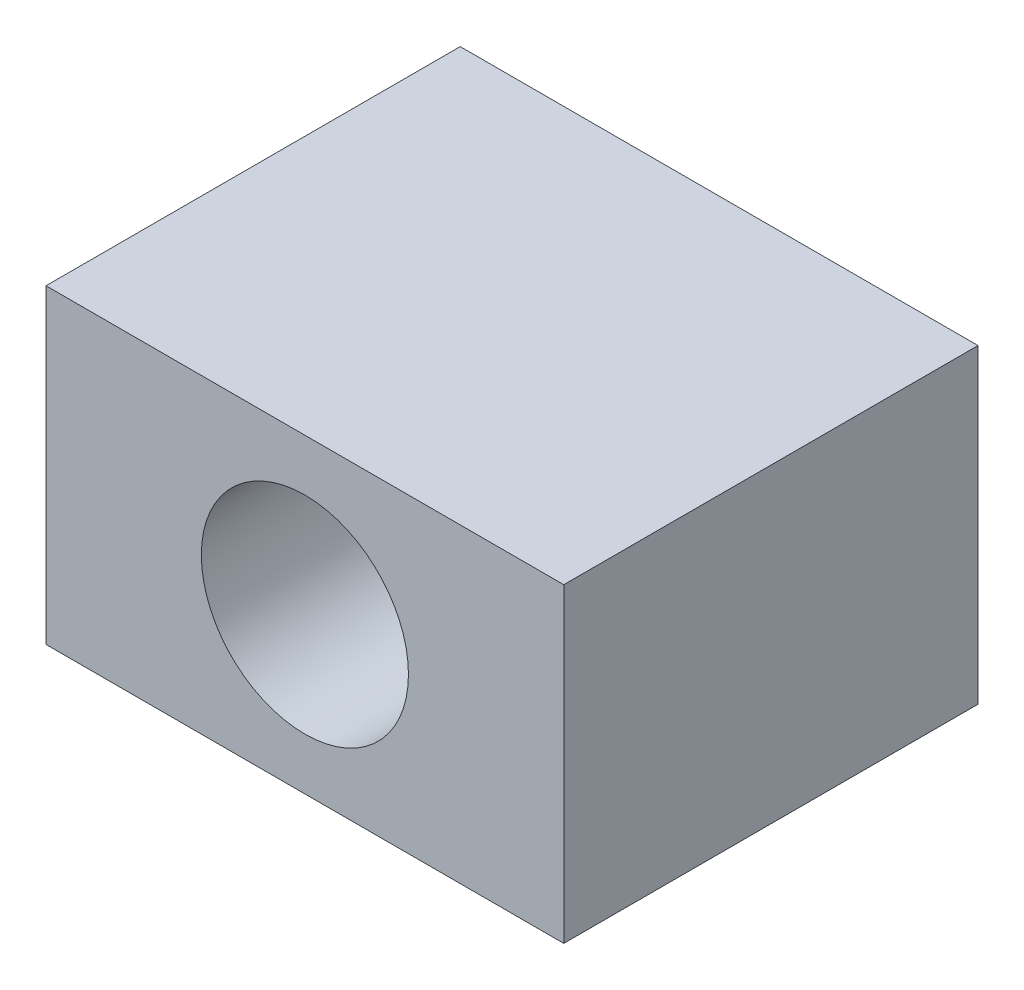
ISO-10303-21;
HEADER;
FILE_DESCRIPTION(('STEP AP214'),'2;1');
FILE_NAME('part.step','',(''),(''),'','','');
FILE_SCHEMA(('AUTOMOTIVE_DESIGN { 1 0 10303 214 1 1 1 1 }'));
ENDSEC;
DATA;
#1=APPLICATION_CONTEXT('core data for automotive mechanical design processes');
#2=APPLICATION_PROTOCOL_DEFINITION('international standard','automotive_design',2000,#1);
#3=PRODUCT_CONTEXT('',#1,'mechanical');
#4=PRODUCT('Part','Part','',(#3));
#5=PRODUCT_RELATED_PRODUCT_CATEGORY('part','',(#4));
#6=PRODUCT_DEFINITION_FORMATION('','',#4);
#7=PRODUCT_DEFINITION_CONTEXT('part definition',#1,'design');
#8=PRODUCT_DEFINITION('design','',#6,#7);
#9=PRODUCT_DEFINITION_SHAPE('','',#8);
#10=(LENGTH_UNIT() NAMED_UNIT(*) SI_UNIT(.MILLI.,.METRE.));
#11=(NAMED_UNIT(*) PLANE_ANGLE_UNIT() SI_UNIT($,.RADIAN.));
#12=(NAMED_UNIT(*) SI_UNIT($,.STERADIAN.) SOLID_ANGLE_UNIT());
#13=UNCERTAINTY_MEASURE_WITH_UNIT(LENGTH_MEASURE(1.E-05),#10,'distance_accuracy_value','');
#14=(GEOMETRIC_REPRESENTATION_CONTEXT(3) GLOBAL_UNCERTAINTY_ASSIGNED_CONTEXT((#13)) GLOBAL_UNIT_ASSIGNED_CONTEXT((#10,
#11,#12)) REPRESENTATION_CONTEXT('',''));
#15=CARTESIAN_POINT('',(0.,0.,0.));
#16=DIRECTION('',(0.,0.,1.));
#17=DIRECTION('',(1.,0.,0.));
#18=AXIS2_PLACEMENT_3D('',#15,#16,#17);
#19=CARTESIAN_POINT('',(2.5,1.5,4.));
#20=DIRECTION('',(-1.,0.,0.));
#21=DIRECTION('',(0.,-1.,0.));
#22=AXIS2_PLACEMENT_3D('',#19,#20,#21);
#23=PLANE('',#22);
#24=DIRECTION('',(0.,1.,0.));
#25=VECTOR('',#24,1.);
#26=CARTESIAN_POINT('',(2.5,1.5,0.));
#27=LINE('',#26,#25);
#28=CARTESIAN_POINT('',(2.5,-1.5,0.));
#29=VERTEX_POINT('',#28);
#30=CARTESIAN_POINT('',(2.5,1.5,0.));
#31=VERTEX_POINT('',#30);
#32=EDGE_CURVE('E96',#29,#31,#27,.T.);
#33=ORIENTED_EDGE('',*,*,#32,.T.);
#34=DIRECTION('',(0.,0.,-1.));
#35=VECTOR('',#34,1.);
#36=CARTESIAN_POINT('',(2.5,1.5,4.));
#37=LINE('',#36,#35);
#38=CARTESIAN_POINT('',(2.5,1.5,4.));
#39=VERTEX_POINT('',#38);
#40=EDGE_CURVE('E11',#39,#31,#37,.T.);
#41=ORIENTED_EDGE('',*,*,#40,.F.);
#42=DIRECTION('',(0.,1.,0.));
#43=VECTOR('',#42,1.);
#44=CARTESIAN_POINT('',(2.5,1.5,4.));
#45=LINE('',#44,#43);
#46=CARTESIAN_POINT('',(2.5,-1.5,4.));
#47=VERTEX_POINT('',#46);
#48=EDGE_CURVE('E84',#47,#39,#45,.T.);
#49=ORIENTED_EDGE('',*,*,#48,.F.);
#50=DIRECTION('',(0.,0.,-1.));
#51=VECTOR('',#50,1.);
#52=CARTESIAN_POINT('',(2.5,-1.5,4.));
#53=LINE('',#52,#51);
#54=EDGE_CURVE('E92',#47,#29,#53,.T.);
#55=ORIENTED_EDGE('',*,*,#54,.T.);
#56=EDGE_LOOP('',(#33,#41,#49,#55));
#57=FACE_BOUND('',#56,.T.);
#58=ADVANCED_FACE('F33',(#57),#23,.F.);
#59=CARTESIAN_POINT('',(-2.5,1.5,4.));
#60=DIRECTION('',(0.,-1.,0.));
#61=DIRECTION('',(0.,0.,-1.));
#62=AXIS2_PLACEMENT_3D('',#59,#60,#61);
#63=PLANE('',#62);
#64=DIRECTION('',(-1.,0.,0.));
#65=VECTOR('',#64,1.);
#66=CARTESIAN_POINT('',(-2.5,1.5,0.));
#67=LINE('',#66,#65);
#68=CARTESIAN_POINT('',(-2.5,1.5,0.));
#69=VERTEX_POINT('',#68);
#70=EDGE_CURVE('E88',#31,#69,#67,.T.);
#71=ORIENTED_EDGE('',*,*,#70,.T.);
#72=DIRECTION('',(0.,0.,-1.));
#73=VECTOR('',#72,1.);
#74=CARTESIAN_POINT('',(-2.5,1.5,4.));
#75=LINE('',#74,#73);
#76=CARTESIAN_POINT('',(-2.5,1.5,4.));
#77=VERTEX_POINT('',#76);
#78=EDGE_CURVE('E41',#77,#69,#75,.T.);
#79=ORIENTED_EDGE('',*,*,#78,.F.);
#80=DIRECTION('',(-1.,0.,0.));
#81=VECTOR('',#80,1.);
#82=CARTESIAN_POINT('',(-2.5,1.5,4.));
#83=LINE('',#82,#81);
#84=EDGE_CURVE('E79',#39,#77,#83,.T.);
#85=ORIENTED_EDGE('',*,*,#84,.F.);
#86=ORIENTED_EDGE('',*,*,#40,.T.);
#87=EDGE_LOOP('',(#71,#79,#85,#86));
#88=FACE_BOUND('',#87,.T.);
#89=ADVANCED_FACE('F87',(#88),#63,.F.);
#90=CARTESIAN_POINT('',(-2.5,1.5,4.));
#91=DIRECTION('',(1.,0.,0.));
#92=DIRECTION('',(0.,0.,-1.));
#93=AXIS2_PLACEMENT_3D('',#90,#91,#92);
#94=PLANE('',#93);
#95=DIRECTION('',(0.,-1.,0.));
#96=VECTOR('',#95,1.);
#97=CARTESIAN_POINT('',(-2.5,1.5,0.));
#98=LINE('',#97,#96);
#99=CARTESIAN_POINT('',(-2.5,-1.5,0.));
#100=VERTEX_POINT('',#99);
#101=EDGE_CURVE('E66',#69,#100,#98,.T.);
#102=ORIENTED_EDGE('',*,*,#101,.T.);
#103=DIRECTION('',(0.,0.,-1.));
#104=VECTOR('',#103,1.);
#105=CARTESIAN_POINT('',(-2.5,-1.5,4.));
#106=LINE('',#105,#104);
#107=CARTESIAN_POINT('',(-2.5,-1.5,4.));
#108=VERTEX_POINT('',#107);
#109=EDGE_CURVE('E89',#108,#100,#106,.T.);
#110=ORIENTED_EDGE('',*,*,#109,.F.);
#111=DIRECTION('',(0.,-1.,0.));
#112=VECTOR('',#111,1.);
#113=CARTESIAN_POINT('',(-2.5,1.5,4.));
#114=LINE('',#113,#112);
#115=EDGE_CURVE('E82',#77,#108,#114,.T.);
#116=ORIENTED_EDGE('',*,*,#115,.F.);
#117=ORIENTED_EDGE('',*,*,#78,.T.);
#118=EDGE_LOOP('',(#102,#110,#116,#117));
#119=FACE_BOUND('',#118,.T.);
#120=ADVANCED_FACE('F90',(#119),#94,.F.);
#121=CARTESIAN_POINT('',(-2.5,-1.5,4.));
#122=DIRECTION('',(0.,1.,0.));
#123=DIRECTION('',(0.,0.,1.));
#124=AXIS2_PLACEMENT_3D('',#121,#122,#123);
#125=PLANE('',#124);
#126=DIRECTION('',(1.,0.,0.));
#127=VECTOR('',#126,1.);
#128=CARTESIAN_POINT('',(-2.5,-1.5,0.));
#129=LINE('',#128,#127);
#130=EDGE_CURVE('E72',#100,#29,#129,.T.);
#131=ORIENTED_EDGE('',*,*,#130,.T.);
#132=ORIENTED_EDGE('',*,*,#54,.F.);
#133=DIRECTION('',(1.,0.,0.));
#134=VECTOR('',#133,1.);
#135=CARTESIAN_POINT('',(-2.5,-1.5,4.));
#136=LINE('',#135,#134);
#137=EDGE_CURVE('E49',#108,#47,#136,.T.);
#138=ORIENTED_EDGE('',*,*,#137,.F.);
#139=ORIENTED_EDGE('',*,*,#109,.T.);
#140=EDGE_LOOP('',(#131,#132,#138,#139));
#141=FACE_BOUND('',#140,.T.);
#142=ADVANCED_FACE('F104',(#141),#125,.F.);
#143=CARTESIAN_POINT('',(0.,0.,4.));
#144=DIRECTION('',(0.,0.,1.));
#145=DIRECTION('',(1.,0.,0.));
#146=AXIS2_PLACEMENT_3D('',#143,#144,#145);
#147=PLANE('',#146);
#148=CARTESIAN_POINT('',(0.,0.,4.));
#149=DIRECTION('',(0.,0.,1.));
#150=DIRECTION('',(1.,0.,0.));
#151=AXIS2_PLACEMENT_3D('',#148,#149,#150);
#152=CIRCLE('',#151,1.);
#153=CARTESIAN_POINT('',(1.,0.,4.));
#154=VERTEX_POINT('',#153);
#155=EDGE_CURVE('E110',#154,#154,#152,.T.);
#156=ORIENTED_EDGE('',*,*,#155,.F.);
#157=EDGE_LOOP('',(#156));
#158=FACE_BOUND('',#157,.T.);
#159=ORIENTED_EDGE('',*,*,#48,.T.);
#160=ORIENTED_EDGE('',*,*,#84,.T.);
#161=ORIENTED_EDGE('',*,*,#115,.T.);
#162=ORIENTED_EDGE('',*,*,#137,.T.);
#163=EDGE_LOOP('',(#159,#160,#161,#162));
#164=FACE_BOUND('',#163,.T.);
#165=ADVANCED_FACE('F80',(#158,#164),#147,.T.);
#166=CARTESIAN_POINT('',(0.,0.,0.));
#167=DIRECTION('',(0.,0.,1.));
#168=DIRECTION('',(1.,0.,0.));
#169=AXIS2_PLACEMENT_3D('',#166,#167,#168);
#170=PLANE('',#169);
#171=ORIENTED_EDGE('',*,*,#32,.F.);
#172=ORIENTED_EDGE('',*,*,#130,.F.);
#173=ORIENTED_EDGE('',*,*,#101,.F.);
#174=ORIENTED_EDGE('',*,*,#70,.F.);
#175=EDGE_LOOP('',(#171,#172,#173,#174));
#176=FACE_BOUND('',#175,.T.);
#177=ADVANCED_FACE('F107',(#176),#170,.F.);
#178=CARTESIAN_POINT('',(0.,0.,1.));
#179=DIRECTION('',(0.,0.,1.));
#180=DIRECTION('',(1.,0.,0.));
#181=AXIS2_PLACEMENT_3D('',#178,#179,#180);
#182=CYLINDRICAL_SURFACE('',#181,1.);
#183=CARTESIAN_POINT('',(0.,0.,1.));
#184=DIRECTION('',(0.,0.,1.));
#185=DIRECTION('',(1.,0.,0.));
#186=AXIS2_PLACEMENT_3D('',#183,#184,#185);
#187=CIRCLE('',#186,1.);
#188=CARTESIAN_POINT('',(1.,0.,1.));
#189=VERTEX_POINT('',#188);
#190=EDGE_CURVE('E99',#189,#189,#187,.T.);
#191=ORIENTED_EDGE('',*,*,#190,.F.);
#192=EDGE_LOOP('',(#191));
#193=FACE_BOUND('',#192,.T.);
#194=ORIENTED_EDGE('',*,*,#155,.T.);
#195=EDGE_LOOP('',(#194));
#196=FACE_BOUND('',#195,.T.);
#197=ADVANCED_FACE('F118',(#193,#196),#182,.F.);
#198=CARTESIAN_POINT('',(0.,0.,1.));
#199=DIRECTION('',(0.,0.,1.));
#200=DIRECTION('',(1.,0.,0.));
#201=AXIS2_PLACEMENT_3D('',#198,#199,#200);
#202=PLANE('',#201);
#203=ORIENTED_EDGE('',*,*,#190,.T.);
#204=EDGE_LOOP('',(#203));
#205=FACE_BOUND('',#204,.T.);
#206=ADVANCED_FACE('F116',(#205),#202,.T.);
#207=CLOSED_SHELL('',(#58,#89,#120,#142,#165,#177,#197,#206));
#208=MANIFOLD_SOLID_BREP('B2',#207);
#209=ADVANCED_BREP_SHAPE_REPRESENTATION('',(#18,#208),#14);
#210=SHAPE_DEFINITION_REPRESENTATION(#9,#209);
ENDSEC;
END-ISO-10303-21;
